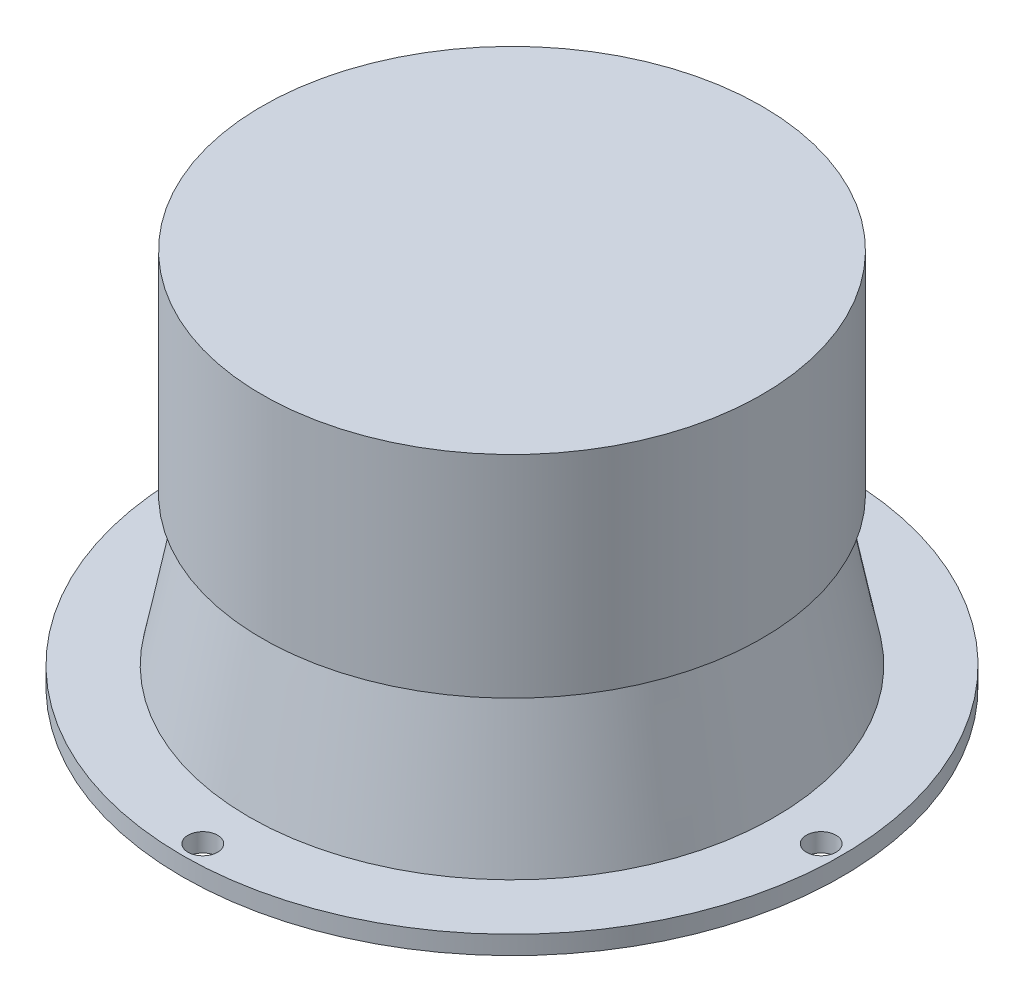
ISO-10303-21;
HEADER;
FILE_DESCRIPTION(('STEP AP214'),'2;1');
FILE_NAME('part.step','',(''),(''),'','','');
FILE_SCHEMA(('AUTOMOTIVE_DESIGN { 1 0 10303 214 1 1 1 1 }'));
ENDSEC;
DATA;
#1=APPLICATION_CONTEXT('core data for automotive mechanical design processes');
#2=APPLICATION_PROTOCOL_DEFINITION('international standard','automotive_design',2000,#1);
#3=PRODUCT_CONTEXT('',#1,'mechanical');
#4=PRODUCT('Part','Part','',(#3));
#5=PRODUCT_RELATED_PRODUCT_CATEGORY('part','',(#4));
#6=PRODUCT_DEFINITION_FORMATION('','',#4);
#7=PRODUCT_DEFINITION_CONTEXT('part definition',#1,'design');
#8=PRODUCT_DEFINITION('design','',#6,#7);
#9=PRODUCT_DEFINITION_SHAPE('','',#8);
#10=(LENGTH_UNIT() NAMED_UNIT(*) SI_UNIT(.MILLI.,.METRE.));
#11=(NAMED_UNIT(*) PLANE_ANGLE_UNIT() SI_UNIT($,.RADIAN.));
#12=(NAMED_UNIT(*) SI_UNIT($,.STERADIAN.) SOLID_ANGLE_UNIT());
#13=UNCERTAINTY_MEASURE_WITH_UNIT(LENGTH_MEASURE(1.E-05),#10,'distance_accuracy_value','');
#14=(GEOMETRIC_REPRESENTATION_CONTEXT(3) GLOBAL_UNCERTAINTY_ASSIGNED_CONTEXT((#13)) GLOBAL_UNIT_ASSIGNED_CONTEXT((#10,
#11,#12)) REPRESENTATION_CONTEXT('',''));
#15=CARTESIAN_POINT('',(0.,0.,0.));
#16=DIRECTION('',(0.,0.,1.));
#17=DIRECTION('',(1.,0.,0.));
#18=AXIS2_PLACEMENT_3D('',#15,#16,#17);
#19=CARTESIAN_POINT('',(0.,2.5,0.));
#20=DIRECTION('',(0.,1.,0.));
#21=DIRECTION('',(0.,0.,1.));
#22=AXIS2_PLACEMENT_3D('',#19,#20,#21);
#23=PLANE('',#22);
#24=CARTESIAN_POINT('',(0.,2.5,0.));
#25=DIRECTION('',(0.,1.,0.));
#26=DIRECTION('',(0.,0.,1.));
#27=AXIS2_PLACEMENT_3D('',#24,#25,#26);
#28=CIRCLE('',#27,35.5);
#29=CARTESIAN_POINT('',(0.,2.5,35.5));
#30=VERTEX_POINT('',#29);
#31=EDGE_CURVE('E10',#30,#30,#28,.T.);
#32=ORIENTED_EDGE('',*,*,#31,.F.);
#33=EDGE_LOOP('',(#32));
#34=FACE_BOUND('',#33,.T.);
#35=CARTESIAN_POINT('',(2.35787403627941E-12,2.5,41.75));
#36=DIRECTION('',(0.,1.,0.));
#37=DIRECTION('',(0.,0.,1.));
#38=AXIS2_PLACEMENT_3D('',#35,#36,#37);
#39=CIRCLE('',#38,2.00000000000253);
#40=CARTESIAN_POINT('',(2.35787403627941E-12,2.5,43.7500000000025));
#41=VERTEX_POINT('',#40);
#42=EDGE_CURVE('E63',#41,#41,#39,.T.);
#43=ORIENTED_EDGE('',*,*,#42,.F.);
#44=EDGE_LOOP('',(#43));
#45=FACE_BOUND('',#44,.T.);
#46=CARTESIAN_POINT('',(0.,2.5,-41.75));
#47=DIRECTION('',(0.,1.,0.));
#48=DIRECTION('',(0.,0.,1.));
#49=AXIS2_PLACEMENT_3D('',#46,#47,#48);
#50=CIRCLE('',#49,2.);
#51=CARTESIAN_POINT('',(0.,2.5,-39.75));
#52=VERTEX_POINT('',#51);
#53=EDGE_CURVE('E75',#52,#52,#50,.T.);
#54=ORIENTED_EDGE('',*,*,#53,.F.);
#55=EDGE_LOOP('',(#54));
#56=FACE_BOUND('',#55,.T.);
#57=CARTESIAN_POINT('',(0.,2.5,0.));
#58=DIRECTION('',(0.,1.,0.));
#59=DIRECTION('',(0.,0.,1.));
#60=AXIS2_PLACEMENT_3D('',#57,#58,#59);
#61=CIRCLE('',#60,44.5);
#62=CARTESIAN_POINT('',(0.,2.5,44.5));
#63=VERTEX_POINT('',#62);
#64=EDGE_CURVE('E43',#63,#63,#61,.T.);
#65=ORIENTED_EDGE('',*,*,#64,.T.);
#66=EDGE_LOOP('',(#65));
#67=FACE_BOUND('',#66,.T.);
#68=CARTESIAN_POINT('',(41.7500000000012,2.5,-1.17893701813971E-12));
#69=DIRECTION('',(0.,1.,0.));
#70=DIRECTION('',(0.,0.,1.));
#71=AXIS2_PLACEMENT_3D('',#68,#69,#70);
#72=CIRCLE('',#71,2.00000000000092);
#73=CARTESIAN_POINT('',(41.7500000000012,2.5,1.99999999999975));
#74=VERTEX_POINT('',#73);
#75=EDGE_CURVE('E69',#74,#74,#72,.T.);
#76=ORIENTED_EDGE('',*,*,#75,.F.);
#77=EDGE_LOOP('',(#76));
#78=FACE_BOUND('',#77,.T.);
#79=CARTESIAN_POINT('',(-41.7499999999988,2.5,1.18404991852615E-12));
#80=DIRECTION('',(0.,1.,0.));
#81=DIRECTION('',(0.,0.,1.));
#82=AXIS2_PLACEMENT_3D('',#79,#80,#81);
#83=CIRCLE('',#82,2.0000000000019);
#84=CARTESIAN_POINT('',(-41.7499999999988,2.5,2.00000000000308));
#85=VERTEX_POINT('',#84);
#86=EDGE_CURVE('E57',#85,#85,#83,.T.);
#87=ORIENTED_EDGE('',*,*,#86,.F.);
#88=EDGE_LOOP('',(#87));
#89=FACE_BOUND('',#88,.T.);
#90=ADVANCED_FACE('F30',(#34,#45,#56,#67,#78,#89),#23,.T.);
#91=CARTESIAN_POINT('',(0.,0.,0.));
#92=DIRECTION('',(0.,1.,0.));
#93=DIRECTION('',(0.,0.,1.));
#94=AXIS2_PLACEMENT_3D('',#91,#92,#93);
#95=PLANE('',#94);
#96=CARTESIAN_POINT('',(0.,0.,0.));
#97=DIRECTION('',(0.,-1.,0.));
#98=DIRECTION('',(0.,0.,-1.));
#99=AXIS2_PLACEMENT_3D('',#96,#97,#98);
#100=CIRCLE('',#99,34.);
#101=CARTESIAN_POINT('',(0.,0.,-34.));
#102=VERTEX_POINT('',#101);
#103=EDGE_CURVE('E38',#102,#102,#100,.T.);
#104=ORIENTED_EDGE('',*,*,#103,.F.);
#105=EDGE_LOOP('',(#104));
#106=FACE_BOUND('',#105,.T.);
#107=CARTESIAN_POINT('',(0.,0.,0.));
#108=DIRECTION('',(0.,1.,0.));
#109=DIRECTION('',(0.,0.,1.));
#110=AXIS2_PLACEMENT_3D('',#107,#108,#109);
#111=CIRCLE('',#110,44.5);
#112=CARTESIAN_POINT('',(0.,0.,44.5));
#113=VERTEX_POINT('',#112);
#114=EDGE_CURVE('E34',#113,#113,#111,.T.);
#115=ORIENTED_EDGE('',*,*,#114,.F.);
#116=EDGE_LOOP('',(#115));
#117=FACE_BOUND('',#116,.T.);
#118=CARTESIAN_POINT('',(0.,0.,-41.75));
#119=DIRECTION('',(0.,1.,0.));
#120=DIRECTION('',(0.,0.,1.));
#121=AXIS2_PLACEMENT_3D('',#118,#119,#120);
#122=CIRCLE('',#121,2.);
#123=CARTESIAN_POINT('',(0.,0.,-39.75));
#124=VERTEX_POINT('',#123);
#125=EDGE_CURVE('E72',#124,#124,#122,.T.);
#126=ORIENTED_EDGE('',*,*,#125,.T.);
#127=EDGE_LOOP('',(#126));
#128=FACE_BOUND('',#127,.T.);
#129=CARTESIAN_POINT('',(41.7500000000012,0.,-1.17893701813971E-12));
#130=DIRECTION('',(0.,1.,0.));
#131=DIRECTION('',(0.,0.,1.));
#132=AXIS2_PLACEMENT_3D('',#129,#130,#131);
#133=CIRCLE('',#132,2.00000000000092);
#134=CARTESIAN_POINT('',(41.7500000000012,0.,1.99999999999975));
#135=VERTEX_POINT('',#134);
#136=EDGE_CURVE('E66',#135,#135,#133,.T.);
#137=ORIENTED_EDGE('',*,*,#136,.T.);
#138=EDGE_LOOP('',(#137));
#139=FACE_BOUND('',#138,.T.);
#140=CARTESIAN_POINT('',(2.35787403627941E-12,0.,41.75));
#141=DIRECTION('',(0.,1.,0.));
#142=DIRECTION('',(0.,0.,1.));
#143=AXIS2_PLACEMENT_3D('',#140,#141,#142);
#144=CIRCLE('',#143,2.00000000000253);
#145=CARTESIAN_POINT('',(2.35787403627941E-12,0.,43.7500000000025));
#146=VERTEX_POINT('',#145);
#147=EDGE_CURVE('E60',#146,#146,#144,.T.);
#148=ORIENTED_EDGE('',*,*,#147,.T.);
#149=EDGE_LOOP('',(#148));
#150=FACE_BOUND('',#149,.T.);
#151=CARTESIAN_POINT('',(-41.7499999999988,0.,1.18404991852615E-12));
#152=DIRECTION('',(0.,1.,0.));
#153=DIRECTION('',(0.,0.,1.));
#154=AXIS2_PLACEMENT_3D('',#151,#152,#153);
#155=CIRCLE('',#154,2.0000000000019);
#156=CARTESIAN_POINT('',(-41.7499999999988,0.,2.00000000000308));
#157=VERTEX_POINT('',#156);
#158=EDGE_CURVE('E55',#157,#157,#155,.T.);
#159=ORIENTED_EDGE('',*,*,#158,.T.);
#160=EDGE_LOOP('',(#159));
#161=FACE_BOUND('',#160,.T.);
#162=ADVANCED_FACE('F86',(#106,#117,#128,#139,#150,#161),#95,.F.);
#163=CARTESIAN_POINT('',(0.,2.5,0.));
#164=DIRECTION('',(0.,-1.,0.));
#165=DIRECTION('',(0.,0.,-1.));
#166=AXIS2_PLACEMENT_3D('',#163,#164,#165);
#167=CYLINDRICAL_SURFACE('',#166,44.5);
#168=ORIENTED_EDGE('',*,*,#64,.F.);
#169=EDGE_LOOP('',(#168));
#170=FACE_BOUND('',#169,.T.);
#171=ORIENTED_EDGE('',*,*,#114,.T.);
#172=EDGE_LOOP('',(#171));
#173=FACE_BOUND('',#172,.T.);
#174=ADVANCED_FACE('F32',(#170,#173),#167,.T.);
#175=CARTESIAN_POINT('',(0.,2.5,-41.75));
#176=DIRECTION('',(0.,-1.,0.));
#177=DIRECTION('',(0.,0.,-1.));
#178=AXIS2_PLACEMENT_3D('',#175,#176,#177);
#179=CYLINDRICAL_SURFACE('',#178,2.);
#180=ORIENTED_EDGE('',*,*,#53,.T.);
#181=EDGE_LOOP('',(#180));
#182=FACE_BOUND('',#181,.T.);
#183=ORIENTED_EDGE('',*,*,#125,.F.);
#184=EDGE_LOOP('',(#183));
#185=FACE_BOUND('',#184,.T.);
#186=ADVANCED_FACE('F121',(#182,#185),#179,.F.);
#187=CARTESIAN_POINT('',(41.7500000000012,2.5,-1.17893701813971E-12));
#188=DIRECTION('',(0.,-1.,0.));
#189=DIRECTION('',(0.,0.,-1.));
#190=AXIS2_PLACEMENT_3D('',#187,#188,#189);
#191=CYLINDRICAL_SURFACE('',#190,2.00000000000092);
#192=ORIENTED_EDGE('',*,*,#75,.T.);
#193=EDGE_LOOP('',(#192));
#194=FACE_BOUND('',#193,.T.);
#195=ORIENTED_EDGE('',*,*,#136,.F.);
#196=EDGE_LOOP('',(#195));
#197=FACE_BOUND('',#196,.T.);
#198=ADVANCED_FACE('F111',(#194,#197),#191,.F.);
#199=CARTESIAN_POINT('',(2.35787403627941E-12,2.5,41.75));
#200=DIRECTION('',(0.,-1.,0.));
#201=DIRECTION('',(0.,0.,-1.));
#202=AXIS2_PLACEMENT_3D('',#199,#200,#201);
#203=CYLINDRICAL_SURFACE('',#202,2.00000000000253);
#204=ORIENTED_EDGE('',*,*,#42,.T.);
#205=EDGE_LOOP('',(#204));
#206=FACE_BOUND('',#205,.T.);
#207=ORIENTED_EDGE('',*,*,#147,.F.);
#208=EDGE_LOOP('',(#207));
#209=FACE_BOUND('',#208,.T.);
#210=ADVANCED_FACE('F101',(#206,#209),#203,.F.);
#211=CARTESIAN_POINT('',(-41.7499999999988,2.5,1.18404991852615E-12));
#212=DIRECTION('',(0.,-1.,0.));
#213=DIRECTION('',(0.,0.,-1.));
#214=AXIS2_PLACEMENT_3D('',#211,#212,#213);
#215=CYLINDRICAL_SURFACE('',#214,2.0000000000019);
#216=ORIENTED_EDGE('',*,*,#86,.T.);
#217=EDGE_LOOP('',(#216));
#218=FACE_BOUND('',#217,.T.);
#219=ORIENTED_EDGE('',*,*,#158,.F.);
#220=EDGE_LOOP('',(#219));
#221=FACE_BOUND('',#220,.T.);
#222=ADVANCED_FACE('F98',(#218,#221),#215,.F.);
#223=CARTESIAN_POINT('',(0.,-1.,0.));
#224=DIRECTION('',(0.,1.,0.));
#225=DIRECTION('',(0.,0.,1.));
#226=AXIS2_PLACEMENT_3D('',#223,#224,#225);
#227=CYLINDRICAL_SURFACE('',#226,34.);
#228=CARTESIAN_POINT('',(0.,-1.,0.));
#229=DIRECTION('',(0.,-1.,0.));
#230=DIRECTION('',(0.,0.,-1.));
#231=AXIS2_PLACEMENT_3D('',#228,#229,#230);
#232=CIRCLE('',#231,34.);
#233=CARTESIAN_POINT('',(0.,-1.,-34.));
#234=VERTEX_POINT('',#233);
#235=EDGE_CURVE('E52',#234,#234,#232,.T.);
#236=ORIENTED_EDGE('',*,*,#235,.F.);
#237=EDGE_LOOP('',(#236));
#238=FACE_BOUND('',#237,.T.);
#239=ORIENTED_EDGE('',*,*,#103,.T.);
#240=EDGE_LOOP('',(#239));
#241=FACE_BOUND('',#240,.T.);
#242=ADVANCED_FACE('F100',(#238,#241),#227,.T.);
#243=CARTESIAN_POINT('',(0.,-1.,0.));
#244=DIRECTION('',(0.,-1.,0.));
#245=DIRECTION('',(0.,0.,-1.));
#246=AXIS2_PLACEMENT_3D('',#243,#244,#245);
#247=PLANE('',#246);
#248=ORIENTED_EDGE('',*,*,#235,.T.);
#249=EDGE_LOOP('',(#248));
#250=FACE_BOUND('',#249,.T.);
#251=ADVANCED_FACE('F108',(#250),#247,.T.);
#252=CARTESIAN_POINT('',(0.,2.5,0.));
#253=DIRECTION('',(0.,-1.,0.));
#254=DIRECTION('',(0.,0.,1.));
#255=AXIS2_PLACEMENT_3D('',#252,#253,#254);
#256=CONICAL_SURFACE('',#255,35.5,0.191986217719376);
#257=CARTESIAN_POINT('',(0.,22.5,0.));
#258=DIRECTION('',(0.,1.,0.));
#259=DIRECTION('',(0.,0.,1.));
#260=AXIS2_PLACEMENT_3D('',#257,#258,#259);
#261=CIRCLE('',#260,31.6123938172456);
#262=CARTESIAN_POINT('',(0.,22.5,31.6123938172456));
#263=VERTEX_POINT('',#262);
#264=EDGE_CURVE('E49',#263,#263,#261,.T.);
#265=ORIENTED_EDGE('',*,*,#264,.F.);
#266=EDGE_LOOP('',(#265));
#267=FACE_BOUND('',#266,.T.);
#268=ORIENTED_EDGE('',*,*,#31,.T.);
#269=EDGE_LOOP('',(#268));
#270=FACE_BOUND('',#269,.T.);
#271=ADVANCED_FACE('F167',(#267,#270),#256,.T.);
#272=CARTESIAN_POINT('',(0.,51.,0.));
#273=DIRECTION('',(0.,-1.,0.));
#274=DIRECTION('',(0.,0.,-1.));
#275=AXIS2_PLACEMENT_3D('',#272,#273,#274);
#276=CYLINDRICAL_SURFACE('',#275,33.75);
#277=CARTESIAN_POINT('',(0.,51.,0.));
#278=DIRECTION('',(0.,1.,0.));
#279=DIRECTION('',(0.,0.,1.));
#280=AXIS2_PLACEMENT_3D('',#277,#278,#279);
#281=CIRCLE('',#280,33.75);
#282=CARTESIAN_POINT('',(0.,51.,-33.75));
#283=VERTEX_POINT('',#282);
#284=EDGE_CURVE('E53',#283,#283,#281,.T.);
#285=CARTESIAN_POINT('',(0.,22.5,0.));
#286=DIRECTION('',(0.,1.,0.));
#287=DIRECTION('',(0.,0.,1.));
#288=AXIS2_PLACEMENT_3D('',#285,#286,#287);
#289=CIRCLE('',#288,33.75);
#290=CARTESIAN_POINT('',(0.,22.5,-33.75));
#291=VERTEX_POINT('',#290);
#292=EDGE_CURVE('E47',#291,#291,#289,.T.);
#293=CARTESIAN_POINT('',(0.,51.,-33.75));
#294=CARTESIAN_POINT('',(0.,50.703125,-33.75));
#295=CARTESIAN_POINT('',(0.,50.40625,-33.75));
#296=CARTESIAN_POINT('',(0.,49.8125,-33.75));
#297=CARTESIAN_POINT('',(0.,49.515625,-33.75));
#298=CARTESIAN_POINT('',(0.,48.921875,-33.75));
#299=CARTESIAN_POINT('',(0.,48.625,-33.75));
#300=CARTESIAN_POINT('',(0.,48.03125,-33.75));
#301=CARTESIAN_POINT('',(0.,47.734375,-33.75));
#302=CARTESIAN_POINT('',(0.,47.140625,-33.75));
#303=CARTESIAN_POINT('',(0.,46.84375,-33.75));
#304=CARTESIAN_POINT('',(0.,46.25,-33.75));
#305=CARTESIAN_POINT('',(0.,45.953125,-33.75));
#306=CARTESIAN_POINT('',(0.,45.359375,-33.75));
#307=CARTESIAN_POINT('',(0.,45.0625,-33.75));
#308=CARTESIAN_POINT('',(0.,44.46875,-33.75));
#309=CARTESIAN_POINT('',(0.,44.171875,-33.75));
#310=CARTESIAN_POINT('',(0.,43.578125,-33.75));
#311=CARTESIAN_POINT('',(0.,43.28125,-33.75));
#312=CARTESIAN_POINT('',(0.,42.6875,-33.75));
#313=CARTESIAN_POINT('',(0.,42.390625,-33.75));
#314=CARTESIAN_POINT('',(0.,41.796875,-33.75));
#315=CARTESIAN_POINT('',(0.,41.5,-33.75));
#316=CARTESIAN_POINT('',(0.,40.90625,-33.75));
#317=CARTESIAN_POINT('',(0.,40.609375,-33.75));
#318=CARTESIAN_POINT('',(0.,40.015625,-33.75));
#319=CARTESIAN_POINT('',(0.,39.71875,-33.75));
#320=CARTESIAN_POINT('',(0.,39.125,-33.75));
#321=CARTESIAN_POINT('',(0.,38.828125,-33.75));
#322=CARTESIAN_POINT('',(0.,38.234375,-33.75));
#323=CARTESIAN_POINT('',(0.,37.9375,-33.75));
#324=CARTESIAN_POINT('',(0.,37.34375,-33.75));
#325=CARTESIAN_POINT('',(0.,37.046875,-33.75));
#326=CARTESIAN_POINT('',(0.,36.453125,-33.75));
#327=CARTESIAN_POINT('',(0.,36.15625,-33.75));
#328=CARTESIAN_POINT('',(0.,35.5625,-33.75));
#329=CARTESIAN_POINT('',(0.,35.265625,-33.75));
#330=CARTESIAN_POINT('',(0.,34.671875,-33.75));
#331=CARTESIAN_POINT('',(0.,34.375,-33.75));
#332=CARTESIAN_POINT('',(0.,33.78125,-33.75));
#333=CARTESIAN_POINT('',(0.,33.484375,-33.75));
#334=CARTESIAN_POINT('',(0.,32.890625,-33.75));
#335=CARTESIAN_POINT('',(0.,32.59375,-33.75));
#336=CARTESIAN_POINT('',(0.,32.,-33.75));
#337=CARTESIAN_POINT('',(0.,31.703125,-33.75));
#338=CARTESIAN_POINT('',(0.,31.109375,-33.75));
#339=CARTESIAN_POINT('',(0.,30.8125,-33.75));
#340=CARTESIAN_POINT('',(0.,30.21875,-33.75));
#341=CARTESIAN_POINT('',(0.,29.921875,-33.75));
#342=CARTESIAN_POINT('',(0.,29.328125,-33.75));
#343=CARTESIAN_POINT('',(0.,29.03125,-33.75));
#344=CARTESIAN_POINT('',(0.,28.4375,-33.75));
#345=CARTESIAN_POINT('',(0.,28.140625,-33.75));
#346=CARTESIAN_POINT('',(0.,27.546875,-33.75));
#347=CARTESIAN_POINT('',(0.,27.25,-33.75));
#348=CARTESIAN_POINT('',(0.,26.65625,-33.75));
#349=CARTESIAN_POINT('',(0.,26.359375,-33.75));
#350=CARTESIAN_POINT('',(0.,25.765625,-33.75));
#351=CARTESIAN_POINT('',(0.,25.46875,-33.75));
#352=CARTESIAN_POINT('',(0.,24.875,-33.75));
#353=CARTESIAN_POINT('',(0.,24.578125,-33.75));
#354=CARTESIAN_POINT('',(0.,23.984375,-33.75));
#355=CARTESIAN_POINT('',(0.,23.6875,-33.75));
#356=CARTESIAN_POINT('',(0.,23.09375,-33.75));
#357=CARTESIAN_POINT('',(0.,22.796875,-33.75));
#358=CARTESIAN_POINT('',(0.,22.5,-33.75));
#359=B_SPLINE_CURVE_WITH_KNOTS('',3,(#293,#294,#295,#296,#297,#298,#299,#300,#301,#302,#303,
#304,#305,#306,#307,#308,#309,#310,#311,#312,#313,#314,#315,#316,#317,#318,#319,#320,#321,#322,
#323,#324,#325,#326,#327,#328,#329,#330,#331,#332,#333,#334,#335,#336,#337,#338,#339,#340,#341,
#342,#343,#344,#345,#346,#347,#348,#349,#350,#351,#352,#353,#354,#355,#356,#357,#358),
.UNSPECIFIED.,.F.,.F.,(4,2,2,2,2,2,2,2,2,2,2,2,2,2,2,2,2,2,2,2,2,2,2,2,2,2,2,2,2,2,2,2,4),(0.,
0.890625000000006,1.78125000000001,2.671875,3.5625,4.453125,5.34375,6.23437500000001,
7.12500000000001,8.01562500000001,8.90625,9.796875,10.6875,11.578125,12.46875,13.359375,14.25,
15.140625,16.03125,16.921875,17.8125,18.703125,19.59375,20.484375,21.375,22.265625,23.15625,
24.046875,24.9375,25.828125,26.71875,27.609375,28.5),.UNSPECIFIED.);
#360=EDGE_CURVE('BSEAM181',#283,#291,#359,.T.);
#361=ORIENTED_EDGE('',*,*,#284,.F.);
#362=ORIENTED_EDGE('',*,*,#292,.T.);
#363=ORIENTED_EDGE('',*,*,#360,.T.);
#364=ORIENTED_EDGE('',*,*,#360,.F.);
#365=EDGE_LOOP('',(#361,#363,#362,#364));
#366=FACE_BOUND('',#365,.T.);
#367=ADVANCED_FACE('F181',(#366),#276,.T.);
#368=CARTESIAN_POINT('',(0.,51.,0.));
#369=DIRECTION('',(0.,1.,0.));
#370=DIRECTION('',(0.,0.,1.));
#371=AXIS2_PLACEMENT_3D('',#368,#369,#370);
#372=PLANE('',#371);
#373=ORIENTED_EDGE('',*,*,#284,.T.);
#374=EDGE_LOOP('',(#373));
#375=FACE_BOUND('',#374,.T.);
#376=ADVANCED_FACE('F191',(#375),#372,.T.);
#377=CARTESIAN_POINT('',(0.,22.5,0.));
#378=DIRECTION('',(0.,1.,0.));
#379=DIRECTION('',(0.,0.,1.));
#380=AXIS2_PLACEMENT_3D('',#377,#378,#379);
#381=PLANE('',#380);
#382=ORIENTED_EDGE('',*,*,#264,.T.);
#383=EDGE_LOOP('',(#382));
#384=FACE_BOUND('',#383,.T.);
#385=ORIENTED_EDGE('',*,*,#292,.F.);
#386=EDGE_LOOP('',(#385));
#387=FACE_BOUND('',#386,.T.);
#388=ADVANCED_FACE('F201',(#384,#387),#381,.F.);
#389=CLOSED_SHELL('',(#90,#162,#174,#186,#198,#210,#222,#242,#251,#271,#367,#376,#388));
#390=MANIFOLD_SOLID_BREP('B2',#389);
#391=ADVANCED_BREP_SHAPE_REPRESENTATION('',(#18,#390),#14);
#392=SHAPE_DEFINITION_REPRESENTATION(#9,#391);
ENDSEC;
END-ISO-10303-21;
